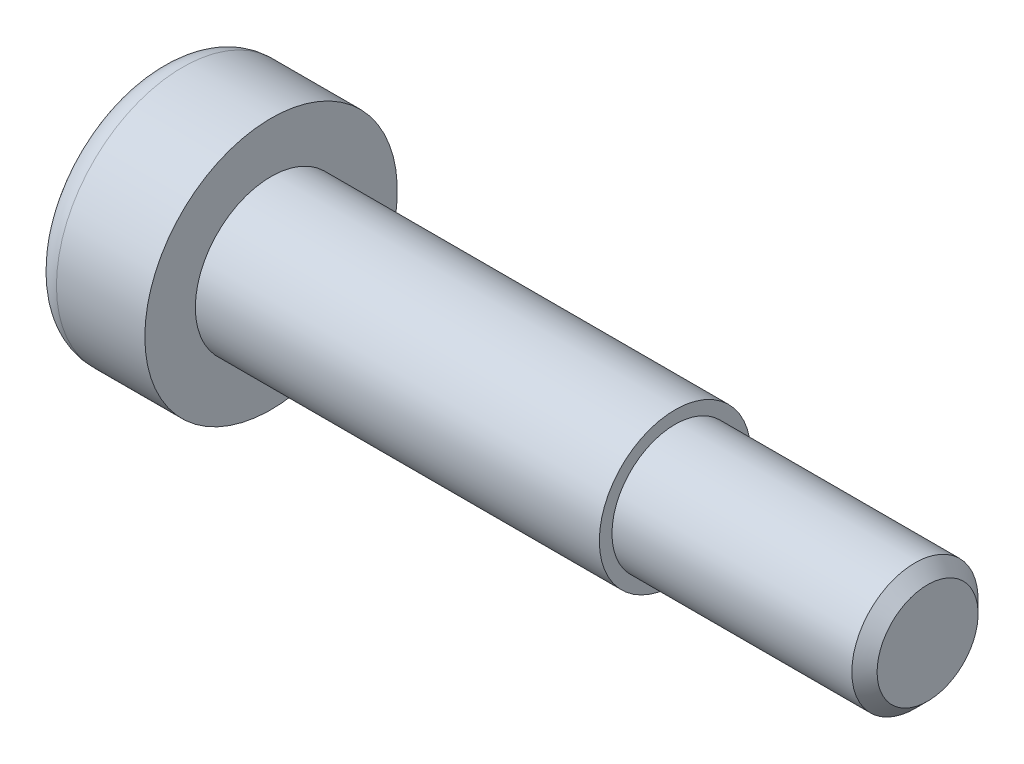
ISO-10303-21;
HEADER;
FILE_DESCRIPTION(('STEP AP214'),'2;1');
FILE_NAME('part.step','',(''),(''),'','','');
FILE_SCHEMA(('AUTOMOTIVE_DESIGN { 1 0 10303 214 1 1 1 1 }'));
ENDSEC;
DATA;
#1=APPLICATION_CONTEXT('core data for automotive mechanical design processes');
#2=APPLICATION_PROTOCOL_DEFINITION('international standard','automotive_design',2000,#1);
#3=PRODUCT_CONTEXT('',#1,'mechanical');
#4=PRODUCT('Part','Part','',(#3));
#5=PRODUCT_RELATED_PRODUCT_CATEGORY('part','',(#4));
#6=PRODUCT_DEFINITION_FORMATION('','',#4);
#7=PRODUCT_DEFINITION_CONTEXT('part definition',#1,'design');
#8=PRODUCT_DEFINITION('design','',#6,#7);
#9=PRODUCT_DEFINITION_SHAPE('','',#8);
#10=(LENGTH_UNIT() NAMED_UNIT(*) SI_UNIT(.MILLI.,.METRE.));
#11=(NAMED_UNIT(*) PLANE_ANGLE_UNIT() SI_UNIT($,.RADIAN.));
#12=(NAMED_UNIT(*) SI_UNIT($,.STERADIAN.) SOLID_ANGLE_UNIT());
#13=UNCERTAINTY_MEASURE_WITH_UNIT(LENGTH_MEASURE(1.E-05),#10,'distance_accuracy_value','');
#14=(GEOMETRIC_REPRESENTATION_CONTEXT(3) GLOBAL_UNCERTAINTY_ASSIGNED_CONTEXT((#13)) GLOBAL_UNIT_ASSIGNED_CONTEXT((#10,
#11,#12)) REPRESENTATION_CONTEXT('',''));
#15=CARTESIAN_POINT('',(0.,0.,0.));
#16=DIRECTION('',(0.,0.,1.));
#17=DIRECTION('',(1.,0.,0.));
#18=AXIS2_PLACEMENT_3D('',#15,#16,#17);
#19=CARTESIAN_POINT('',(0.,0.,0.));
#20=DIRECTION('',(1.,0.,0.));
#21=DIRECTION('',(0.,0.,-1.));
#22=AXIS2_PLACEMENT_3D('',#19,#20,#21);
#23=PLANE('',#22);
#24=CARTESIAN_POINT('',(0.,0.,0.));
#25=DIRECTION('',(1.,0.,0.));
#26=DIRECTION('',(0.,0.,-1.));
#27=AXIS2_PLACEMENT_3D('',#24,#25,#26);
#28=CIRCLE('',#27,4.);
#29=CARTESIAN_POINT('',(0.,0.,-4.));
#30=VERTEX_POINT('',#29);
#31=EDGE_CURVE('E155',#30,#30,#28,.F.);
#32=ORIENTED_EDGE('',*,*,#31,.T.);
#33=EDGE_LOOP('',(#32));
#34=FACE_BOUND('',#33,.T.);
#35=DIRECTION('',(0.,-0.5,-0.866025403784439));
#36=VECTOR('',#35,1.);
#37=CARTESIAN_POINT('',(0.,1.73205080756888,0.));
#38=LINE('',#37,#36);
#39=CARTESIAN_POINT('',(0.,1.73205080756888,0.));
#40=VERTEX_POINT('',#39);
#41=CARTESIAN_POINT('',(0.,0.866025403784439,-1.5));
#42=VERTEX_POINT('',#41);
#43=EDGE_CURVE('E125',#40,#42,#38,.T.);
#44=ORIENTED_EDGE('',*,*,#43,.F.);
#45=DIRECTION('',(0.,0.5,-0.866025403784439));
#46=VECTOR('',#45,1.);
#47=CARTESIAN_POINT('',(0.,0.86602540378444,1.5));
#48=LINE('',#47,#46);
#49=CARTESIAN_POINT('',(0.,0.86602540378444,1.5));
#50=VERTEX_POINT('',#49);
#51=EDGE_CURVE('E51',#50,#40,#48,.T.);
#52=ORIENTED_EDGE('',*,*,#51,.F.);
#53=DIRECTION('',(0.,1.,0.));
#54=VECTOR('',#53,1.);
#55=CARTESIAN_POINT('',(0.,-0.866025403784439,1.5));
#56=LINE('',#55,#54);
#57=CARTESIAN_POINT('',(0.,-0.866025403784439,1.5));
#58=VERTEX_POINT('',#57);
#59=EDGE_CURVE('E134',#58,#50,#56,.T.);
#60=ORIENTED_EDGE('',*,*,#59,.F.);
#61=DIRECTION('',(0.,0.5,0.866025403784439));
#62=VECTOR('',#61,1.);
#63=CARTESIAN_POINT('',(0.,-1.73205080756888,0.));
#64=LINE('',#63,#62);
#65=CARTESIAN_POINT('',(0.,-1.73205080756888,0.));
#66=VERTEX_POINT('',#65);
#67=EDGE_CURVE('E132',#66,#58,#64,.T.);
#68=ORIENTED_EDGE('',*,*,#67,.F.);
#69=DIRECTION('',(0.,-0.5,0.866025403784439));
#70=VECTOR('',#69,1.);
#71=CARTESIAN_POINT('',(0.,-0.866025403784439,-1.5));
#72=LINE('',#71,#70);
#73=CARTESIAN_POINT('',(0.,-0.866025403784439,-1.5));
#74=VERTEX_POINT('',#73);
#75=EDGE_CURVE('E99',#74,#66,#72,.T.);
#76=ORIENTED_EDGE('',*,*,#75,.F.);
#77=DIRECTION('',(0.,-1.,0.));
#78=VECTOR('',#77,1.);
#79=CARTESIAN_POINT('',(0.,0.866025403784439,-1.5));
#80=LINE('',#79,#78);
#81=EDGE_CURVE('E128',#42,#74,#80,.T.);
#82=ORIENTED_EDGE('',*,*,#81,.F.);
#83=EDGE_LOOP('',(#44,#52,#60,#68,#76,#82));
#84=FACE_BOUND('',#83,.T.);
#85=ADVANCED_FACE('F36',(#34,#84),#23,.F.);
#86=CARTESIAN_POINT('',(0.,0.,0.));
#87=DIRECTION('',(-1.,0.,0.));
#88=DIRECTION('',(0.,0.,1.));
#89=AXIS2_PLACEMENT_3D('',#86,#87,#88);
#90=CYLINDRICAL_SURFACE('',#89,5.);
#91=CARTESIAN_POINT('',(1.,0.,0.));
#92=DIRECTION('',(1.,0.,0.));
#93=DIRECTION('',(0.,0.,-1.));
#94=AXIS2_PLACEMENT_3D('',#91,#92,#93);
#95=CIRCLE('',#94,5.);
#96=CARTESIAN_POINT('',(1.,0.,-5.));
#97=VERTEX_POINT('',#96);
#98=EDGE_CURVE('E158',#97,#97,#95,.T.);
#99=ORIENTED_EDGE('',*,*,#98,.T.);
#100=EDGE_LOOP('',(#99));
#101=FACE_BOUND('',#100,.T.);
#102=CARTESIAN_POINT('',(4.5,0.,0.));
#103=DIRECTION('',(-1.,0.,0.));
#104=DIRECTION('',(0.,0.,1.));
#105=AXIS2_PLACEMENT_3D('',#102,#103,#104);
#106=CIRCLE('',#105,5.);
#107=CARTESIAN_POINT('',(4.5,0.,5.));
#108=VERTEX_POINT('',#107);
#109=EDGE_CURVE('E152',#108,#108,#106,.T.);
#110=ORIENTED_EDGE('',*,*,#109,.T.);
#111=EDGE_LOOP('',(#110));
#112=FACE_BOUND('',#111,.T.);
#113=ADVANCED_FACE('F175',(#101,#112),#90,.T.);
#114=CARTESIAN_POINT('',(4.5,5.,0.));
#115=DIRECTION('',(-1.,0.,0.));
#116=DIRECTION('',(0.,0.,1.));
#117=AXIS2_PLACEMENT_3D('',#114,#115,#116);
#118=PLANE('',#117);
#119=ORIENTED_EDGE('',*,*,#109,.F.);
#120=EDGE_LOOP('',(#119));
#121=FACE_BOUND('',#120,.T.);
#122=CARTESIAN_POINT('',(4.5,0.,0.));
#123=DIRECTION('',(-1.,0.,0.));
#124=DIRECTION('',(0.,0.,1.));
#125=AXIS2_PLACEMENT_3D('',#122,#123,#124);
#126=CIRCLE('',#125,3.);
#127=CARTESIAN_POINT('',(4.5,0.,3.));
#128=VERTEX_POINT('',#127);
#129=EDGE_CURVE('E149',#128,#128,#126,.T.);
#130=ORIENTED_EDGE('',*,*,#129,.T.);
#131=EDGE_LOOP('',(#130));
#132=FACE_BOUND('',#131,.T.);
#133=ADVANCED_FACE('F181',(#121,#132),#118,.F.);
#134=CARTESIAN_POINT('',(0.,0.,0.));
#135=DIRECTION('',(-1.,0.,0.));
#136=DIRECTION('',(0.,0.,1.));
#137=AXIS2_PLACEMENT_3D('',#134,#135,#136);
#138=CYLINDRICAL_SURFACE('',#137,3.);
#139=ORIENTED_EDGE('',*,*,#129,.F.);
#140=EDGE_LOOP('',(#139));
#141=FACE_BOUND('',#140,.T.);
#142=CARTESIAN_POINT('',(20.5,0.,0.));
#143=DIRECTION('',(-1.,0.,0.));
#144=DIRECTION('',(0.,0.,1.));
#145=AXIS2_PLACEMENT_3D('',#142,#143,#144);
#146=CIRCLE('',#145,3.);
#147=CARTESIAN_POINT('',(20.5,0.,3.));
#148=VERTEX_POINT('',#147);
#149=EDGE_CURVE('E146',#148,#148,#146,.T.);
#150=ORIENTED_EDGE('',*,*,#149,.T.);
#151=EDGE_LOOP('',(#150));
#152=FACE_BOUND('',#151,.T.);
#153=ADVANCED_FACE('F188',(#141,#152),#138,.T.);
#154=CARTESIAN_POINT('',(20.5,3.,0.));
#155=DIRECTION('',(-1.,0.,0.));
#156=DIRECTION('',(0.,0.,1.));
#157=AXIS2_PLACEMENT_3D('',#154,#155,#156);
#158=PLANE('',#157);
#159=ORIENTED_EDGE('',*,*,#149,.F.);
#160=EDGE_LOOP('',(#159));
#161=FACE_BOUND('',#160,.T.);
#162=CARTESIAN_POINT('',(20.5,0.,0.));
#163=DIRECTION('',(-1.,0.,0.));
#164=DIRECTION('',(0.,0.,1.));
#165=AXIS2_PLACEMENT_3D('',#162,#163,#164);
#166=CIRCLE('',#165,2.5);
#167=CARTESIAN_POINT('',(20.5,0.,2.5));
#168=VERTEX_POINT('',#167);
#169=EDGE_CURVE('E138',#168,#168,#166,.T.);
#170=ORIENTED_EDGE('',*,*,#169,.T.);
#171=EDGE_LOOP('',(#170));
#172=FACE_BOUND('',#171,.T.);
#173=ADVANCED_FACE('F192',(#161,#172),#158,.F.);
#174=CARTESIAN_POINT('',(0.,0.,0.));
#175=DIRECTION('',(-1.,0.,0.));
#176=DIRECTION('',(0.,0.,1.));
#177=AXIS2_PLACEMENT_3D('',#174,#175,#176);
#178=CYLINDRICAL_SURFACE('',#177,2.5);
#179=CARTESIAN_POINT('',(30.,0.,0.));
#180=DIRECTION('',(-1.,0.,0.));
#181=DIRECTION('',(0.,0.,1.));
#182=AXIS2_PLACEMENT_3D('',#179,#180,#181);
#183=CIRCLE('',#182,2.5);
#184=CARTESIAN_POINT('',(30.,0.,2.5));
#185=VERTEX_POINT('',#184);
#186=EDGE_CURVE('E44',#185,#185,#183,.T.);
#187=ORIENTED_EDGE('',*,*,#186,.T.);
#188=EDGE_LOOP('',(#187));
#189=FACE_BOUND('',#188,.T.);
#190=ORIENTED_EDGE('',*,*,#169,.F.);
#191=EDGE_LOOP('',(#190));
#192=FACE_BOUND('',#191,.T.);
#193=ADVANCED_FACE('F163',(#189,#192),#178,.T.);
#194=CARTESIAN_POINT('',(30.5,2.5,0.));
#195=DIRECTION('',(-1.,0.,0.));
#196=DIRECTION('',(0.,0.,1.));
#197=AXIS2_PLACEMENT_3D('',#194,#195,#196);
#198=PLANE('',#197);
#199=CARTESIAN_POINT('',(30.5,0.,0.));
#200=DIRECTION('',(-1.,0.,0.));
#201=DIRECTION('',(0.,0.,1.));
#202=AXIS2_PLACEMENT_3D('',#199,#200,#201);
#203=CIRCLE('',#202,1.99999999999999);
#204=CARTESIAN_POINT('',(30.5,0.,1.99999999999999));
#205=VERTEX_POINT('',#204);
#206=EDGE_CURVE('E11',#205,#205,#203,.F.);
#207=ORIENTED_EDGE('',*,*,#206,.T.);
#208=EDGE_LOOP('',(#207));
#209=FACE_BOUND('',#208,.T.);
#210=ADVANCED_FACE('F199',(#209),#198,.F.);
#211=CARTESIAN_POINT('',(3.,0.86602540378444,1.5));
#212=DIRECTION('',(0.,0.866025403784439,0.5));
#213=DIRECTION('',(0.,-0.5,0.866025403784439));
#214=AXIS2_PLACEMENT_3D('',#211,#212,#213);
#215=PLANE('',#214);
#216=ORIENTED_EDGE('',*,*,#51,.T.);
#217=DIRECTION('',(-1.,0.,0.));
#218=VECTOR('',#217,1.);
#219=CARTESIAN_POINT('',(3.,1.73205080756888,0.));
#220=LINE('',#219,#218);
#221=CARTESIAN_POINT('',(3.,1.73205080756888,0.));
#222=VERTEX_POINT('',#221);
#223=EDGE_CURVE('E81',#222,#40,#220,.T.);
#224=ORIENTED_EDGE('',*,*,#223,.F.);
#225=DIRECTION('',(0.,0.5,-0.866025403784439));
#226=VECTOR('',#225,1.);
#227=CARTESIAN_POINT('',(3.,0.86602540378444,1.5));
#228=LINE('',#227,#226);
#229=CARTESIAN_POINT('',(3.,0.86602540378444,1.5));
#230=VERTEX_POINT('',#229);
#231=EDGE_CURVE('E136',#230,#222,#228,.T.);
#232=ORIENTED_EDGE('',*,*,#231,.F.);
#233=DIRECTION('',(-1.,0.,0.));
#234=VECTOR('',#233,1.);
#235=CARTESIAN_POINT('',(3.,0.86602540378444,1.5));
#236=LINE('',#235,#234);
#237=EDGE_CURVE('E59',#230,#50,#236,.T.);
#238=ORIENTED_EDGE('',*,*,#237,.T.);
#239=EDGE_LOOP('',(#216,#224,#232,#238));
#240=FACE_BOUND('',#239,.T.);
#241=ADVANCED_FACE('F202',(#240),#215,.F.);
#242=CARTESIAN_POINT('',(3.,-0.866025403784439,1.5));
#243=DIRECTION('',(0.,0.,1.));
#244=DIRECTION('',(1.,0.,0.));
#245=AXIS2_PLACEMENT_3D('',#242,#243,#244);
#246=PLANE('',#245);
#247=ORIENTED_EDGE('',*,*,#59,.T.);
#248=ORIENTED_EDGE('',*,*,#237,.F.);
#249=DIRECTION('',(0.,1.,0.));
#250=VECTOR('',#249,1.);
#251=CARTESIAN_POINT('',(3.,-0.866025403784439,1.5));
#252=LINE('',#251,#250);
#253=CARTESIAN_POINT('',(3.,-0.866025403784439,1.5));
#254=VERTEX_POINT('',#253);
#255=EDGE_CURVE('E111',#254,#230,#252,.T.);
#256=ORIENTED_EDGE('',*,*,#255,.F.);
#257=DIRECTION('',(-1.,0.,0.));
#258=VECTOR('',#257,1.);
#259=CARTESIAN_POINT('',(3.,-0.866025403784439,1.5));
#260=LINE('',#259,#258);
#261=EDGE_CURVE('E103',#254,#58,#260,.T.);
#262=ORIENTED_EDGE('',*,*,#261,.T.);
#263=EDGE_LOOP('',(#247,#248,#256,#262));
#264=FACE_BOUND('',#263,.T.);
#265=ADVANCED_FACE('F206',(#264),#246,.F.);
#266=CARTESIAN_POINT('',(3.,-1.73205080756888,0.));
#267=DIRECTION('',(0.,-0.866025403784439,0.5));
#268=DIRECTION('',(0.,-0.5,-0.866025403784439));
#269=AXIS2_PLACEMENT_3D('',#266,#267,#268);
#270=PLANE('',#269);
#271=ORIENTED_EDGE('',*,*,#67,.T.);
#272=ORIENTED_EDGE('',*,*,#261,.F.);
#273=DIRECTION('',(0.,0.5,0.866025403784439));
#274=VECTOR('',#273,1.);
#275=CARTESIAN_POINT('',(3.,-1.73205080756888,0.));
#276=LINE('',#275,#274);
#277=CARTESIAN_POINT('',(3.,-1.73205080756888,0.));
#278=VERTEX_POINT('',#277);
#279=EDGE_CURVE('E107',#278,#254,#276,.T.);
#280=ORIENTED_EDGE('',*,*,#279,.F.);
#281=DIRECTION('',(-1.,0.,0.));
#282=VECTOR('',#281,1.);
#283=CARTESIAN_POINT('',(3.,-1.73205080756888,0.));
#284=LINE('',#283,#282);
#285=EDGE_CURVE('E92',#278,#66,#284,.T.);
#286=ORIENTED_EDGE('',*,*,#285,.T.);
#287=EDGE_LOOP('',(#271,#272,#280,#286));
#288=FACE_BOUND('',#287,.T.);
#289=ADVANCED_FACE('F108',(#288),#270,.F.);
#290=CARTESIAN_POINT('',(3.,-0.866025403784439,-1.5));
#291=DIRECTION('',(0.,-0.866025403784438,-0.5));
#292=DIRECTION('',(0.,0.5,-0.866025403784439));
#293=AXIS2_PLACEMENT_3D('',#290,#291,#292);
#294=PLANE('',#293);
#295=ORIENTED_EDGE('',*,*,#75,.T.);
#296=ORIENTED_EDGE('',*,*,#285,.F.);
#297=DIRECTION('',(0.,-0.5,0.866025403784439));
#298=VECTOR('',#297,1.);
#299=CARTESIAN_POINT('',(3.,-0.866025403784439,-1.5));
#300=LINE('',#299,#298);
#301=CARTESIAN_POINT('',(3.,-0.866025403784439,-1.5));
#302=VERTEX_POINT('',#301);
#303=EDGE_CURVE('E96',#302,#278,#300,.T.);
#304=ORIENTED_EDGE('',*,*,#303,.F.);
#305=DIRECTION('',(-1.,0.,0.));
#306=VECTOR('',#305,1.);
#307=CARTESIAN_POINT('',(3.,-0.866025403784439,-1.5));
#308=LINE('',#307,#306);
#309=EDGE_CURVE('E104',#302,#74,#308,.T.);
#310=ORIENTED_EDGE('',*,*,#309,.T.);
#311=EDGE_LOOP('',(#295,#296,#304,#310));
#312=FACE_BOUND('',#311,.T.);
#313=ADVANCED_FACE('F94',(#312),#294,.F.);
#314=CARTESIAN_POINT('',(3.,0.866025403784439,-1.5));
#315=DIRECTION('',(0.,0.,-1.));
#316=DIRECTION('',(-1.,0.,0.));
#317=AXIS2_PLACEMENT_3D('',#314,#315,#316);
#318=PLANE('',#317);
#319=ORIENTED_EDGE('',*,*,#81,.T.);
#320=ORIENTED_EDGE('',*,*,#309,.F.);
#321=DIRECTION('',(0.,-1.,0.));
#322=VECTOR('',#321,1.);
#323=CARTESIAN_POINT('',(3.,0.866025403784439,-1.5));
#324=LINE('',#323,#322);
#325=CARTESIAN_POINT('',(3.,0.866025403784439,-1.5));
#326=VERTEX_POINT('',#325);
#327=EDGE_CURVE('E117',#326,#302,#324,.T.);
#328=ORIENTED_EDGE('',*,*,#327,.F.);
#329=DIRECTION('',(-1.,0.,0.));
#330=VECTOR('',#329,1.);
#331=CARTESIAN_POINT('',(3.,0.866025403784439,-1.5));
#332=LINE('',#331,#330);
#333=EDGE_CURVE('E141',#326,#42,#332,.T.);
#334=ORIENTED_EDGE('',*,*,#333,.T.);
#335=EDGE_LOOP('',(#319,#320,#328,#334));
#336=FACE_BOUND('',#335,.T.);
#337=ADVANCED_FACE('F210',(#336),#318,.F.);
#338=CARTESIAN_POINT('',(3.,1.73205080756888,0.));
#339=DIRECTION('',(0.,0.866025403784439,-0.5));
#340=DIRECTION('',(0.,0.5,0.866025403784439));
#341=AXIS2_PLACEMENT_3D('',#338,#339,#340);
#342=PLANE('',#341);
#343=ORIENTED_EDGE('',*,*,#43,.T.);
#344=ORIENTED_EDGE('',*,*,#333,.F.);
#345=DIRECTION('',(0.,-0.5,-0.866025403784439));
#346=VECTOR('',#345,1.);
#347=CARTESIAN_POINT('',(3.,1.73205080756888,0.));
#348=LINE('',#347,#346);
#349=EDGE_CURVE('E119',#222,#326,#348,.T.);
#350=ORIENTED_EDGE('',*,*,#349,.F.);
#351=ORIENTED_EDGE('',*,*,#223,.T.);
#352=EDGE_LOOP('',(#343,#344,#350,#351));
#353=FACE_BOUND('',#352,.T.);
#354=ADVANCED_FACE('F207',(#353),#342,.F.);
#355=CARTESIAN_POINT('',(3.,0.,0.));
#356=DIRECTION('',(-1.,0.,0.));
#357=DIRECTION('',(0.,0.,1.));
#358=AXIS2_PLACEMENT_3D('',#355,#356,#357);
#359=PLANE('',#358);
#360=ORIENTED_EDGE('',*,*,#231,.T.);
#361=ORIENTED_EDGE('',*,*,#349,.T.);
#362=ORIENTED_EDGE('',*,*,#327,.T.);
#363=ORIENTED_EDGE('',*,*,#303,.T.);
#364=ORIENTED_EDGE('',*,*,#279,.T.);
#365=ORIENTED_EDGE('',*,*,#255,.T.);
#366=EDGE_LOOP('',(#360,#361,#362,#363,#364,#365));
#367=FACE_BOUND('',#366,.T.);
#368=ADVANCED_FACE('F114',(#367),#359,.T.);
#369=CARTESIAN_POINT('',(1.,0.,0.));
#370=DIRECTION('',(1.,0.,0.));
#371=DIRECTION('',(0.,0.,-1.));
#372=AXIS2_PLACEMENT_3D('',#369,#370,#371);
#373=TOROIDAL_SURFACE('',#372,4.,1.);
#374=ORIENTED_EDGE('',*,*,#98,.F.);
#375=EDGE_LOOP('',(#374));
#376=FACE_BOUND('',#375,.T.);
#377=ORIENTED_EDGE('',*,*,#31,.F.);
#378=EDGE_LOOP('',(#377));
#379=FACE_BOUND('',#378,.T.);
#380=ADVANCED_FACE('F167',(#376,#379),#373,.T.);
#381=CARTESIAN_POINT('',(30.,0.,0.));
#382=DIRECTION('',(-1.,0.,0.));
#383=DIRECTION('',(0.,0.,1.));
#384=AXIS2_PLACEMENT_3D('',#381,#382,#383);
#385=CONICAL_SURFACE('',#384,2.5,0.785398163397453);
#386=ORIENTED_EDGE('',*,*,#206,.F.);
#387=EDGE_LOOP('',(#386));
#388=FACE_BOUND('',#387,.T.);
#389=ORIENTED_EDGE('',*,*,#186,.F.);
#390=EDGE_LOOP('',(#389));
#391=FACE_BOUND('',#390,.T.);
#392=ADVANCED_FACE('F38',(#388,#391),#385,.T.);
#393=CLOSED_SHELL('',(#85,#113,#133,#153,#173,#193,#210,#241,#265,#289,#313,#337,#354,#368,#380,#392));
#394=MANIFOLD_SOLID_BREP('B2',#393);
#395=ADVANCED_BREP_SHAPE_REPRESENTATION('',(#18,#394),#14);
#396=SHAPE_DEFINITION_REPRESENTATION(#9,#395);
ENDSEC;
END-ISO-10303-21;
